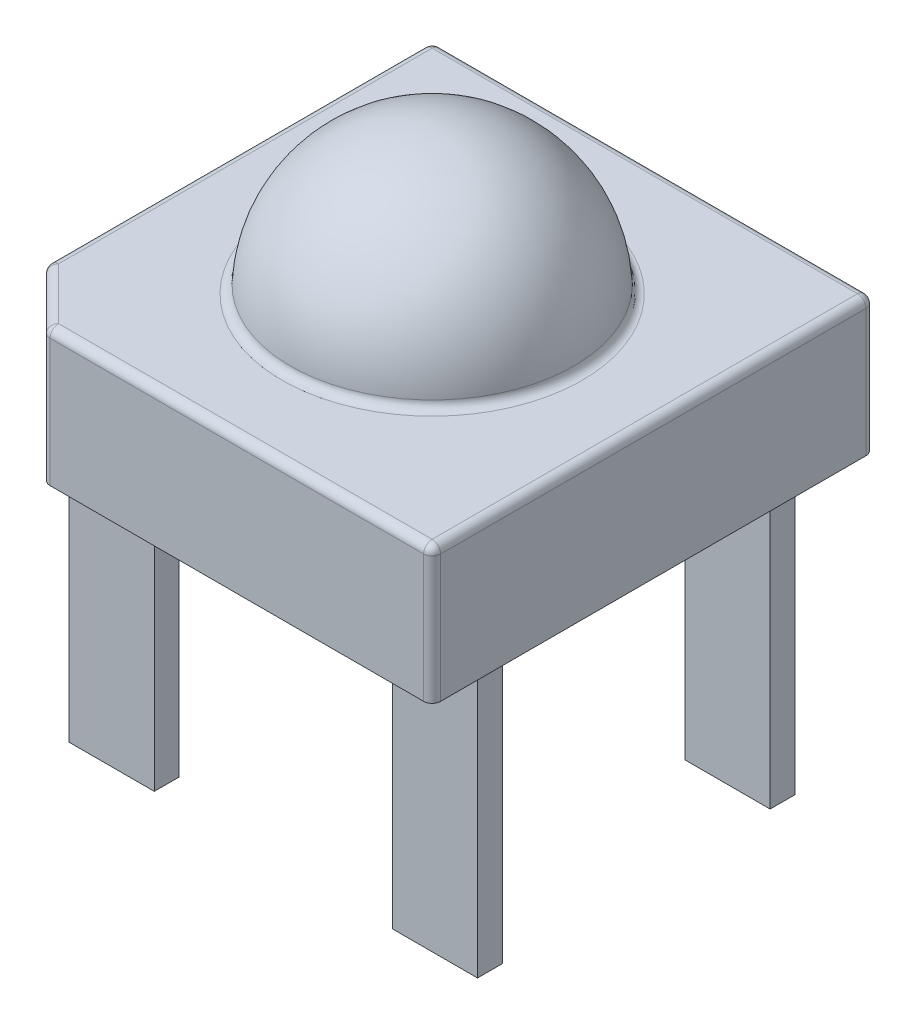
ISO-10303-21;
HEADER;
FILE_DESCRIPTION(('STEP AP214'),'2;1');
FILE_NAME('part.step','',(''),(''),'','','');
FILE_SCHEMA(('AUTOMOTIVE_DESIGN { 1 0 10303 214 1 1 1 1 }'));
ENDSEC;
DATA;
#1=APPLICATION_CONTEXT('core data for automotive mechanical design processes');
#2=APPLICATION_PROTOCOL_DEFINITION('international standard','automotive_design',2000,#1);
#3=PRODUCT_CONTEXT('',#1,'mechanical');
#4=PRODUCT('Part','Part','',(#3));
#5=PRODUCT_RELATED_PRODUCT_CATEGORY('part','',(#4));
#6=PRODUCT_DEFINITION_FORMATION('','',#4);
#7=PRODUCT_DEFINITION_CONTEXT('part definition',#1,'design');
#8=PRODUCT_DEFINITION('design','',#6,#7);
#9=PRODUCT_DEFINITION_SHAPE('','',#8);
#10=(LENGTH_UNIT() NAMED_UNIT(*) SI_UNIT(.MILLI.,.METRE.));
#11=(NAMED_UNIT(*) PLANE_ANGLE_UNIT() SI_UNIT($,.RADIAN.));
#12=(NAMED_UNIT(*) SI_UNIT($,.STERADIAN.) SOLID_ANGLE_UNIT());
#13=UNCERTAINTY_MEASURE_WITH_UNIT(LENGTH_MEASURE(1.E-05),#10,'distance_accuracy_value','');
#14=(GEOMETRIC_REPRESENTATION_CONTEXT(3) GLOBAL_UNCERTAINTY_ASSIGNED_CONTEXT((#13)) GLOBAL_UNIT_ASSIGNED_CONTEXT((#10,
#11,#12)) REPRESENTATION_CONTEXT('',''));
#15=CARTESIAN_POINT('',(0.,0.,0.));
#16=DIRECTION('',(0.,0.,1.));
#17=DIRECTION('',(1.,0.,0.));
#18=AXIS2_PLACEMENT_3D('',#15,#16,#17);
#19=CARTESIAN_POINT('',(3.9,0.,-3.9));
#20=DIRECTION('',(0.,-1.,0.));
#21=DIRECTION('',(0.,0.,-1.));
#22=AXIS2_PLACEMENT_3D('',#19,#20,#21);
#23=PLANE('',#22);
#24=DIRECTION('',(0.,0.,1.));
#25=VECTOR('',#24,1.);
#26=CARTESIAN_POINT('',(3.6,0.,-2.8));
#27=LINE('',#26,#25);
#28=CARTESIAN_POINT('',(3.6,0.,-2.8));
#29=VERTEX_POINT('',#28);
#30=CARTESIAN_POINT('',(3.6,0.,-2.36));
#31=VERTEX_POINT('',#30);
#32=EDGE_CURVE('E251',#29,#31,#27,.T.);
#33=ORIENTED_EDGE('',*,*,#32,.F.);
#34=DIRECTION('',(1.,0.,0.));
#35=VECTOR('',#34,1.);
#36=CARTESIAN_POINT('',(3.6,0.,-2.8));
#37=LINE('',#36,#35);
#38=CARTESIAN_POINT('',(2.1,0.,-2.8));
#39=VERTEX_POINT('',#38);
#40=EDGE_CURVE('E248',#39,#29,#37,.T.);
#41=ORIENTED_EDGE('',*,*,#40,.F.);
#42=DIRECTION('',(0.,0.,-1.));
#43=VECTOR('',#42,1.);
#44=CARTESIAN_POINT('',(2.1,0.,-2.8));
#45=LINE('',#44,#43);
#46=CARTESIAN_POINT('',(2.1,0.,-2.36));
#47=VERTEX_POINT('',#46);
#48=EDGE_CURVE('E260',#47,#39,#45,.T.);
#49=ORIENTED_EDGE('',*,*,#48,.F.);
#50=DIRECTION('',(-1.,0.,0.));
#51=VECTOR('',#50,1.);
#52=CARTESIAN_POINT('',(3.6,0.,-2.36));
#53=LINE('',#52,#51);
#54=EDGE_CURVE('E268',#31,#47,#53,.T.);
#55=ORIENTED_EDGE('',*,*,#54,.F.);
#56=EDGE_LOOP('',(#33,#41,#49,#55));
#57=FACE_BOUND('',#56,.T.);
#58=DIRECTION('',(1.,0.,0.));
#59=VECTOR('',#58,1.);
#60=CARTESIAN_POINT('',(-3.6,0.,2.36));
#61=LINE('',#60,#59);
#62=CARTESIAN_POINT('',(-3.6,0.,2.36));
#63=VERTEX_POINT('',#62);
#64=CARTESIAN_POINT('',(-2.1,0.,2.36));
#65=VERTEX_POINT('',#64);
#66=EDGE_CURVE('E322',#63,#65,#61,.T.);
#67=ORIENTED_EDGE('',*,*,#66,.F.);
#68=DIRECTION('',(0.,0.,-1.));
#69=VECTOR('',#68,1.);
#70=CARTESIAN_POINT('',(-3.6,0.,2.8));
#71=LINE('',#70,#69);
#72=CARTESIAN_POINT('',(-3.6,0.,2.8));
#73=VERTEX_POINT('',#72);
#74=EDGE_CURVE('E308',#73,#63,#71,.T.);
#75=ORIENTED_EDGE('',*,*,#74,.F.);
#76=DIRECTION('',(-1.,0.,0.));
#77=VECTOR('',#76,1.);
#78=CARTESIAN_POINT('',(-3.6,0.,2.8));
#79=LINE('',#78,#77);
#80=CARTESIAN_POINT('',(-2.1,0.,2.8));
#81=VERTEX_POINT('',#80);
#82=EDGE_CURVE('E313',#81,#73,#79,.T.);
#83=ORIENTED_EDGE('',*,*,#82,.F.);
#84=DIRECTION('',(0.,0.,1.));
#85=VECTOR('',#84,1.);
#86=CARTESIAN_POINT('',(-2.1,0.,2.8));
#87=LINE('',#86,#85);
#88=EDGE_CURVE('E324',#65,#81,#87,.T.);
#89=ORIENTED_EDGE('',*,*,#88,.F.);
#90=EDGE_LOOP('',(#67,#75,#83,#89));
#91=FACE_BOUND('',#90,.T.);
#92=DIRECTION('',(0.,0.,1.));
#93=VECTOR('',#92,1.);
#94=CARTESIAN_POINT('',(-3.9,0.,2.9));
#95=LINE('',#94,#93);
#96=CARTESIAN_POINT('',(-3.9,0.,-3.75));
#97=VERTEX_POINT('',#96);
#98=CARTESIAN_POINT('',(-3.9,0.,2.83786796564404));
#99=VERTEX_POINT('',#98);
#100=EDGE_CURVE('E344',#97,#99,#95,.T.);
#101=ORIENTED_EDGE('',*,*,#100,.F.);
#102=CARTESIAN_POINT('',(-3.75,0.,-3.75));
#103=DIRECTION('',(0.,-1.,0.));
#104=DIRECTION('',(0.,0.,-1.));
#105=AXIS2_PLACEMENT_3D('',#102,#103,#104);
#106=CIRCLE('',#105,0.15);
#107=CARTESIAN_POINT('',(-3.75,0.,-3.9));
#108=VERTEX_POINT('',#107);
#109=EDGE_CURVE('E11',#97,#108,#106,.T.);
#110=ORIENTED_EDGE('',*,*,#109,.T.);
#111=DIRECTION('',(-1.,0.,0.));
#112=VECTOR('',#111,1.);
#113=CARTESIAN_POINT('',(-3.9,0.,-3.9));
#114=LINE('',#113,#112);
#115=CARTESIAN_POINT('',(3.75,0.,-3.9));
#116=VERTEX_POINT('',#115);
#117=EDGE_CURVE('E341',#116,#108,#114,.T.);
#118=ORIENTED_EDGE('',*,*,#117,.F.);
#119=CARTESIAN_POINT('',(3.75,0.,-3.75));
#120=DIRECTION('',(0.,-1.,0.));
#121=DIRECTION('',(0.,0.,-1.));
#122=AXIS2_PLACEMENT_3D('',#119,#120,#121);
#123=CIRCLE('',#122,0.15);
#124=CARTESIAN_POINT('',(3.9,0.,-3.75));
#125=VERTEX_POINT('',#124);
#126=EDGE_CURVE('E42',#116,#125,#123,.T.);
#127=ORIENTED_EDGE('',*,*,#126,.T.);
#128=DIRECTION('',(0.,0.,-1.));
#129=VECTOR('',#128,1.);
#130=CARTESIAN_POINT('',(3.9,0.,3.9));
#131=LINE('',#130,#129);
#132=CARTESIAN_POINT('',(3.9,0.,3.75));
#133=VERTEX_POINT('',#132);
#134=EDGE_CURVE('E338',#133,#125,#131,.T.);
#135=ORIENTED_EDGE('',*,*,#134,.F.);
#136=CARTESIAN_POINT('',(3.75,0.,3.75));
#137=DIRECTION('',(0.,-1.,0.));
#138=DIRECTION('',(0.,0.,-1.));
#139=AXIS2_PLACEMENT_3D('',#136,#137,#138);
#140=CIRCLE('',#139,0.15);
#141=CARTESIAN_POINT('',(3.75,0.,3.9));
#142=VERTEX_POINT('',#141);
#143=EDGE_CURVE('E405',#133,#142,#140,.T.);
#144=ORIENTED_EDGE('',*,*,#143,.T.);
#145=DIRECTION('',(1.,0.,0.));
#146=VECTOR('',#145,1.);
#147=CARTESIAN_POINT('',(-2.9,0.,3.9));
#148=LINE('',#147,#146);
#149=CARTESIAN_POINT('',(-2.83786796564403,0.,3.9));
#150=VERTEX_POINT('',#149);
#151=EDGE_CURVE('E350',#150,#142,#148,.T.);
#152=ORIENTED_EDGE('',*,*,#151,.F.);
#153=CARTESIAN_POINT('',(-2.83786796564403,0.,3.75));
#154=DIRECTION('',(0.,-1.,0.));
#155=DIRECTION('',(0.,0.,-1.));
#156=AXIS2_PLACEMENT_3D('',#153,#154,#155);
#157=CIRCLE('',#156,0.15);
#158=CARTESIAN_POINT('',(-2.94393398282202,0.,3.85606601717798));
#159=VERTEX_POINT('',#158);
#160=EDGE_CURVE('E401',#150,#159,#157,.T.);
#161=ORIENTED_EDGE('',*,*,#160,.T.);
#162=DIRECTION('',(0.707106781186548,0.,0.707106781186548));
#163=VECTOR('',#162,1.);
#164=CARTESIAN_POINT('',(-3.9,0.,2.9));
#165=LINE('',#164,#163);
#166=CARTESIAN_POINT('',(-3.85606601717798,0.,2.94393398282202));
#167=VERTEX_POINT('',#166);
#168=EDGE_CURVE('E347',#167,#159,#165,.T.);
#169=ORIENTED_EDGE('',*,*,#168,.F.);
#170=CARTESIAN_POINT('',(-3.75,0.,2.83786796564404));
#171=DIRECTION('',(0.,-1.,0.));
#172=DIRECTION('',(0.,0.,-1.));
#173=AXIS2_PLACEMENT_3D('',#170,#171,#172);
#174=CIRCLE('',#173,0.15);
#175=EDGE_CURVE('E403',#167,#99,#174,.T.);
#176=ORIENTED_EDGE('',*,*,#175,.T.);
#177=EDGE_LOOP('',(#101,#110,#118,#127,#135,#144,#152,#161,#169,#176));
#178=FACE_BOUND('',#177,.T.);
#179=DIRECTION('',(0.,0.,-1.));
#180=VECTOR('',#179,1.);
#181=CARTESIAN_POINT('',(2.1,0.,2.8));
#182=LINE('',#181,#180);
#183=CARTESIAN_POINT('',(2.1,0.,2.8));
#184=VERTEX_POINT('',#183);
#185=CARTESIAN_POINT('',(2.1,0.,2.36));
#186=VERTEX_POINT('',#185);
#187=EDGE_CURVE('E293',#184,#186,#182,.T.);
#188=ORIENTED_EDGE('',*,*,#187,.F.);
#189=DIRECTION('',(-1.,0.,0.));
#190=VECTOR('',#189,1.);
#191=CARTESIAN_POINT('',(3.6,0.,2.8));
#192=LINE('',#191,#190);
#193=CARTESIAN_POINT('',(3.6,0.,2.8));
#194=VERTEX_POINT('',#193);
#195=EDGE_CURVE('E279',#194,#184,#192,.T.);
#196=ORIENTED_EDGE('',*,*,#195,.F.);
#197=DIRECTION('',(0.,0.,1.));
#198=VECTOR('',#197,1.);
#199=CARTESIAN_POINT('',(3.6,0.,2.8));
#200=LINE('',#199,#198);
#201=CARTESIAN_POINT('',(3.6,0.,2.36));
#202=VERTEX_POINT('',#201);
#203=EDGE_CURVE('E284',#202,#194,#200,.T.);
#204=ORIENTED_EDGE('',*,*,#203,.F.);
#205=DIRECTION('',(1.,0.,0.));
#206=VECTOR('',#205,1.);
#207=CARTESIAN_POINT('',(3.6,0.,2.36));
#208=LINE('',#207,#206);
#209=EDGE_CURVE('E295',#186,#202,#208,.T.);
#210=ORIENTED_EDGE('',*,*,#209,.F.);
#211=EDGE_LOOP('',(#188,#196,#204,#210));
#212=FACE_BOUND('',#211,.T.);
#213=DIRECTION('',(0.,0.,1.));
#214=VECTOR('',#213,1.);
#215=CARTESIAN_POINT('',(-2.1,0.,-2.8));
#216=LINE('',#215,#214);
#217=CARTESIAN_POINT('',(-2.1,0.,-2.8));
#218=VERTEX_POINT('',#217);
#219=CARTESIAN_POINT('',(-2.1,0.,-2.36));
#220=VERTEX_POINT('',#219);
#221=EDGE_CURVE('E934',#218,#220,#216,.T.);
#222=ORIENTED_EDGE('',*,*,#221,.F.);
#223=DIRECTION('',(1.,0.,0.));
#224=VECTOR('',#223,1.);
#225=CARTESIAN_POINT('',(-3.6,0.,-2.8));
#226=LINE('',#225,#224);
#227=CARTESIAN_POINT('',(-3.6,0.,-2.8));
#228=VERTEX_POINT('',#227);
#229=EDGE_CURVE('E246',#228,#218,#226,.T.);
#230=ORIENTED_EDGE('',*,*,#229,.F.);
#231=DIRECTION('',(0.,0.,-1.));
#232=VECTOR('',#231,1.);
#233=CARTESIAN_POINT('',(-3.6,0.,-2.8));
#234=LINE('',#233,#232);
#235=CARTESIAN_POINT('',(-3.6,0.,-2.36));
#236=VERTEX_POINT('',#235);
#237=EDGE_CURVE('E242',#236,#228,#234,.T.);
#238=ORIENTED_EDGE('',*,*,#237,.F.);
#239=DIRECTION('',(-1.,0.,0.));
#240=VECTOR('',#239,1.);
#241=CARTESIAN_POINT('',(-3.6,0.,-2.36));
#242=LINE('',#241,#240);
#243=EDGE_CURVE('E931',#220,#236,#242,.T.);
#244=ORIENTED_EDGE('',*,*,#243,.F.);
#245=EDGE_LOOP('',(#222,#230,#238,#244));
#246=FACE_BOUND('',#245,.T.);
#247=ADVANCED_FACE('F33',(#57,#91,#178,#212,#246),#23,.T.);
#248=CARTESIAN_POINT('',(3.9,2.4,-3.9));
#249=DIRECTION('',(0.,-1.,0.));
#250=DIRECTION('',(0.,0.,-1.));
#251=AXIS2_PLACEMENT_3D('',#248,#249,#250);
#252=PLANE('',#251);
#253=CARTESIAN_POINT('',(0.,2.4,0.));
#254=DIRECTION('',(0.,-1.,0.));
#255=DIRECTION('',(0.,0.,-1.));
#256=AXIS2_PLACEMENT_3D('',#253,#254,#255);
#257=CIRCLE('',#256,2.64575131106459);
#258=CARTESIAN_POINT('',(0.,2.4,-2.64575131106459));
#259=VERTEX_POINT('',#258);
#260=EDGE_CURVE('E367',#259,#259,#257,.T.);
#261=ORIENTED_EDGE('',*,*,#260,.T.);
#262=EDGE_LOOP('',(#261));
#263=FACE_BOUND('',#262,.T.);
#264=DIRECTION('',(0.707106781186548,0.,0.707106781186548));
#265=VECTOR('',#264,1.);
#266=CARTESIAN_POINT('',(-3.29393398282202,2.4,3.29393398282202));
#267=LINE('',#266,#265);
#268=CARTESIAN_POINT('',(-3.75,2.4,2.83786796564404));
#269=VERTEX_POINT('',#268);
#270=CARTESIAN_POINT('',(-2.83786796564403,2.4,3.75));
#271=VERTEX_POINT('',#270);
#272=EDGE_CURVE('E362',#269,#271,#267,.T.);
#273=ORIENTED_EDGE('',*,*,#272,.T.);
#274=DIRECTION('',(1.,0.,0.));
#275=VECTOR('',#274,1.);
#276=CARTESIAN_POINT('',(3.9,2.4,3.75));
#277=LINE('',#276,#275);
#278=CARTESIAN_POINT('',(3.75,2.4,3.75));
#279=VERTEX_POINT('',#278);
#280=EDGE_CURVE('E364',#271,#279,#277,.T.);
#281=ORIENTED_EDGE('',*,*,#280,.T.);
#282=DIRECTION('',(0.,0.,-1.));
#283=VECTOR('',#282,1.);
#284=CARTESIAN_POINT('',(3.75,2.4,-3.9));
#285=LINE('',#284,#283);
#286=CARTESIAN_POINT('',(3.75,2.4,-3.75));
#287=VERTEX_POINT('',#286);
#288=EDGE_CURVE('E356',#279,#287,#285,.T.);
#289=ORIENTED_EDGE('',*,*,#288,.T.);
#290=DIRECTION('',(-1.,0.,0.));
#291=VECTOR('',#290,1.);
#292=CARTESIAN_POINT('',(3.9,2.4,-3.75));
#293=LINE('',#292,#291);
#294=CARTESIAN_POINT('',(-3.75,2.4,-3.75));
#295=VERTEX_POINT('',#294);
#296=EDGE_CURVE('E358',#287,#295,#293,.T.);
#297=ORIENTED_EDGE('',*,*,#296,.T.);
#298=DIRECTION('',(0.,0.,1.));
#299=VECTOR('',#298,1.);
#300=CARTESIAN_POINT('',(-3.75,2.4,-3.9));
#301=LINE('',#300,#299);
#302=EDGE_CURVE('E360',#295,#269,#301,.T.);
#303=ORIENTED_EDGE('',*,*,#302,.T.);
#304=EDGE_LOOP('',(#273,#281,#289,#297,#303));
#305=FACE_BOUND('',#304,.T.);
#306=ADVANCED_FACE('F484',(#263,#305),#252,.F.);
#307=CARTESIAN_POINT('',(3.9,2.4,3.9));
#308=DIRECTION('',(-1.,0.,0.));
#309=DIRECTION('',(0.,0.,1.));
#310=AXIS2_PLACEMENT_3D('',#307,#308,#309);
#311=PLANE('',#310);
#312=ORIENTED_EDGE('',*,*,#134,.T.);
#313=DIRECTION('',(0.,-1.,0.));
#314=VECTOR('',#313,1.);
#315=CARTESIAN_POINT('',(3.9,2.4,-3.75));
#316=LINE('',#315,#314);
#317=CARTESIAN_POINT('',(3.9,2.25,-3.75));
#318=VERTEX_POINT('',#317);
#319=EDGE_CURVE('E399',#125,#318,#316,.F.);
#320=ORIENTED_EDGE('',*,*,#319,.T.);
#321=DIRECTION('',(0.,0.,-1.));
#322=VECTOR('',#321,1.);
#323=CARTESIAN_POINT('',(3.9,2.25,3.9));
#324=LINE('',#323,#322);
#325=CARTESIAN_POINT('',(3.9,2.25,3.75));
#326=VERTEX_POINT('',#325);
#327=EDGE_CURVE('E397',#318,#326,#324,.F.);
#328=ORIENTED_EDGE('',*,*,#327,.T.);
#329=DIRECTION('',(0.,-1.,0.));
#330=VECTOR('',#329,1.);
#331=CARTESIAN_POINT('',(3.9,2.4,3.75));
#332=LINE('',#331,#330);
#333=EDGE_CURVE('E395',#326,#133,#332,.T.);
#334=ORIENTED_EDGE('',*,*,#333,.T.);
#335=EDGE_LOOP('',(#312,#320,#328,#334));
#336=FACE_BOUND('',#335,.T.);
#337=ADVANCED_FACE('F503',(#336),#311,.F.);
#338=CARTESIAN_POINT('',(-3.9,2.4,-3.9));
#339=DIRECTION('',(0.,0.,1.));
#340=DIRECTION('',(1.,0.,0.));
#341=AXIS2_PLACEMENT_3D('',#338,#339,#340);
#342=PLANE('',#341);
#343=ORIENTED_EDGE('',*,*,#117,.T.);
#344=DIRECTION('',(0.,-1.,0.));
#345=VECTOR('',#344,1.);
#346=CARTESIAN_POINT('',(-3.75,2.4,-3.9));
#347=LINE('',#346,#345);
#348=CARTESIAN_POINT('',(-3.75,2.25,-3.9));
#349=VERTEX_POINT('',#348);
#350=EDGE_CURVE('E393',#108,#349,#347,.F.);
#351=ORIENTED_EDGE('',*,*,#350,.T.);
#352=DIRECTION('',(-1.,0.,0.));
#353=VECTOR('',#352,1.);
#354=CARTESIAN_POINT('',(-3.9,2.25,-3.9));
#355=LINE('',#354,#353);
#356=CARTESIAN_POINT('',(3.75,2.25,-3.9));
#357=VERTEX_POINT('',#356);
#358=EDGE_CURVE('E391',#349,#357,#355,.F.);
#359=ORIENTED_EDGE('',*,*,#358,.T.);
#360=DIRECTION('',(0.,-1.,0.));
#361=VECTOR('',#360,1.);
#362=CARTESIAN_POINT('',(3.75,2.4,-3.9));
#363=LINE('',#362,#361);
#364=EDGE_CURVE('E389',#357,#116,#363,.T.);
#365=ORIENTED_EDGE('',*,*,#364,.T.);
#366=EDGE_LOOP('',(#343,#351,#359,#365));
#367=FACE_BOUND('',#366,.T.);
#368=ADVANCED_FACE('F493',(#367),#342,.F.);
#369=CARTESIAN_POINT('',(-3.9,2.4,2.9));
#370=DIRECTION('',(1.,0.,0.));
#371=DIRECTION('',(0.,0.,-1.));
#372=AXIS2_PLACEMENT_3D('',#369,#370,#371);
#373=PLANE('',#372);
#374=DIRECTION('',(0.,0.,1.));
#375=VECTOR('',#374,1.);
#376=CARTESIAN_POINT('',(-3.9,2.25,2.9));
#377=LINE('',#376,#375);
#378=CARTESIAN_POINT('',(-3.9,2.25,2.83786796564404));
#379=VERTEX_POINT('',#378);
#380=CARTESIAN_POINT('',(-3.9,2.25,-3.75));
#381=VERTEX_POINT('',#380);
#382=EDGE_CURVE('E385',#379,#381,#377,.F.);
#383=ORIENTED_EDGE('',*,*,#382,.T.);
#384=DIRECTION('',(0.,-1.,0.));
#385=VECTOR('',#384,1.);
#386=CARTESIAN_POINT('',(-3.9,2.4,-3.75));
#387=LINE('',#386,#385);
#388=EDGE_CURVE('E387',#381,#97,#387,.T.);
#389=ORIENTED_EDGE('',*,*,#388,.T.);
#390=ORIENTED_EDGE('',*,*,#100,.T.);
#391=DIRECTION('',(0.,-1.,0.));
#392=VECTOR('',#391,1.);
#393=CARTESIAN_POINT('',(-3.9,2.4,2.83786796564404));
#394=LINE('',#393,#392);
#395=EDGE_CURVE('E383',#99,#379,#394,.F.);
#396=ORIENTED_EDGE('',*,*,#395,.T.);
#397=EDGE_LOOP('',(#383,#389,#390,#396));
#398=FACE_BOUND('',#397,.T.);
#399=ADVANCED_FACE('F461',(#398),#373,.F.);
#400=CARTESIAN_POINT('',(-3.9,2.4,2.9));
#401=DIRECTION('',(0.707106781186548,0.,-0.707106781186548));
#402=DIRECTION('',(-0.707106781186548,0.,-0.707106781186548));
#403=AXIS2_PLACEMENT_3D('',#400,#401,#402);
#404=PLANE('',#403);
#405=DIRECTION('',(0.707106781186548,0.,0.707106781186548));
#406=VECTOR('',#405,1.);
#407=CARTESIAN_POINT('',(-3.9,2.25,2.9));
#408=LINE('',#407,#406);
#409=CARTESIAN_POINT('',(-2.94393398282202,2.25,3.85606601717798));
#410=VERTEX_POINT('',#409);
#411=CARTESIAN_POINT('',(-3.85606601717798,2.25,2.94393398282202));
#412=VERTEX_POINT('',#411);
#413=EDGE_CURVE('E379',#410,#412,#408,.F.);
#414=ORIENTED_EDGE('',*,*,#413,.T.);
#415=DIRECTION('',(0.,-1.,0.));
#416=VECTOR('',#415,1.);
#417=CARTESIAN_POINT('',(-3.85606601717798,2.4,2.94393398282202));
#418=LINE('',#417,#416);
#419=EDGE_CURVE('E381',#412,#167,#418,.T.);
#420=ORIENTED_EDGE('',*,*,#419,.T.);
#421=ORIENTED_EDGE('',*,*,#168,.T.);
#422=DIRECTION('',(0.,-1.,0.));
#423=VECTOR('',#422,1.);
#424=CARTESIAN_POINT('',(-2.94393398282202,2.4,3.85606601717798));
#425=LINE('',#424,#423);
#426=EDGE_CURVE('E377',#159,#410,#425,.F.);
#427=ORIENTED_EDGE('',*,*,#426,.T.);
#428=EDGE_LOOP('',(#414,#420,#421,#427));
#429=FACE_BOUND('',#428,.T.);
#430=ADVANCED_FACE('F529',(#429),#404,.F.);
#431=CARTESIAN_POINT('',(-2.9,2.4,3.9));
#432=DIRECTION('',(0.,0.,-1.));
#433=DIRECTION('',(-1.,0.,0.));
#434=AXIS2_PLACEMENT_3D('',#431,#432,#433);
#435=PLANE('',#434);
#436=ORIENTED_EDGE('',*,*,#151,.T.);
#437=DIRECTION('',(0.,-1.,0.));
#438=VECTOR('',#437,1.);
#439=CARTESIAN_POINT('',(3.75,2.4,3.9));
#440=LINE('',#439,#438);
#441=CARTESIAN_POINT('',(3.75,2.25,3.9));
#442=VERTEX_POINT('',#441);
#443=EDGE_CURVE('E375',#142,#442,#440,.F.);
#444=ORIENTED_EDGE('',*,*,#443,.T.);
#445=DIRECTION('',(1.,0.,0.));
#446=VECTOR('',#445,1.);
#447=CARTESIAN_POINT('',(-2.9,2.25,3.9));
#448=LINE('',#447,#446);
#449=CARTESIAN_POINT('',(-2.83786796564403,2.25,3.9));
#450=VERTEX_POINT('',#449);
#451=EDGE_CURVE('E372',#442,#450,#448,.F.);
#452=ORIENTED_EDGE('',*,*,#451,.T.);
#453=DIRECTION('',(0.,-1.,0.));
#454=VECTOR('',#453,1.);
#455=CARTESIAN_POINT('',(-2.83786796564403,2.4,3.9));
#456=LINE('',#455,#454);
#457=EDGE_CURVE('E370',#450,#150,#456,.T.);
#458=ORIENTED_EDGE('',*,*,#457,.T.);
#459=EDGE_LOOP('',(#436,#444,#452,#458));
#460=FACE_BOUND('',#459,.T.);
#461=ADVANCED_FACE('F520',(#460),#435,.F.);
#462=CARTESIAN_POINT('',(0.,2.4,0.));
#463=DIRECTION('',(0.,-1.,0.));
#464=DIRECTION('',(-1.,0.,0.));
#465=AXIS2_PLACEMENT_3D('',#462,#463,#464);
#466=SPHERICAL_SURFACE('',#465,2.5);
#467=CARTESIAN_POINT('',(0.,2.54150943396226,0.));
#468=DIRECTION('',(0.,-1.,0.));
#469=DIRECTION('',(0.,0.,-1.));
#470=AXIS2_PLACEMENT_3D('',#467,#468,#469);
#471=CIRCLE('',#470,2.49599180289112);
#472=CARTESIAN_POINT('',(0.,2.54150943396226,-2.49599180289112));
#473=VERTEX_POINT('',#472);
#474=EDGE_CURVE('E353',#473,#473,#471,.F.);
#475=ORIENTED_EDGE('',*,*,#474,.T.);
#476=EDGE_LOOP('',(#475));
#477=FACE_BOUND('',#476,.T.);
#478=ADVANCED_FACE('F536',(#477),#466,.T.);
#479=CARTESIAN_POINT('',(0.,2.55,0.));
#480=DIRECTION('',(0.,-1.,0.));
#481=DIRECTION('',(0.,0.,-1.));
#482=AXIS2_PLACEMENT_3D('',#479,#480,#481);
#483=TOROIDAL_SURFACE('',#482,2.64575131106459,0.15);
#484=ORIENTED_EDGE('',*,*,#260,.F.);
#485=EDGE_LOOP('',(#484));
#486=FACE_BOUND('',#485,.T.);
#487=ORIENTED_EDGE('',*,*,#474,.F.);
#488=EDGE_LOOP('',(#487));
#489=FACE_BOUND('',#488,.T.);
#490=ADVANCED_FACE('F552',(#486,#489),#483,.F.);
#491=CARTESIAN_POINT('',(-3.75,2.4,-3.75));
#492=DIRECTION('',(0.,-1.,0.));
#493=DIRECTION('',(0.,0.,-1.));
#494=AXIS2_PLACEMENT_3D('',#491,#492,#493);
#495=CYLINDRICAL_SURFACE('',#494,0.15);
#496=CARTESIAN_POINT('',(-3.75,2.25,-3.75));
#497=DIRECTION('',(0.,1.,0.));
#498=DIRECTION('',(0.,0.,1.));
#499=AXIS2_PLACEMENT_3D('',#496,#497,#498);
#500=CIRCLE('',#499,0.15);
#501=EDGE_CURVE('E37',#349,#381,#500,.T.);
#502=ORIENTED_EDGE('',*,*,#501,.F.);
#503=ORIENTED_EDGE('',*,*,#350,.F.);
#504=ORIENTED_EDGE('',*,*,#109,.F.);
#505=ORIENTED_EDGE('',*,*,#388,.F.);
#506=EDGE_LOOP('',(#502,#503,#504,#505));
#507=FACE_BOUND('',#506,.T.);
#508=ADVANCED_FACE('F35',(#507),#495,.T.);
#509=CARTESIAN_POINT('',(-3.75,2.25,-3.75));
#510=DIRECTION('',(0.,0.,1.));
#511=DIRECTION('',(1.,0.,0.));
#512=AXIS2_PLACEMENT_3D('',#509,#510,#511);
#513=SPHERICAL_SURFACE('',#512,0.15);
#514=CARTESIAN_POINT('',(-3.75,2.25,-3.75));
#515=DIRECTION('',(-1.,0.,0.));
#516=DIRECTION('',(0.,0.,1.));
#517=AXIS2_PLACEMENT_3D('',#514,#515,#516);
#518=CIRCLE('',#517,0.15);
#519=EDGE_CURVE('E441',#349,#295,#518,.F.);
#520=ORIENTED_EDGE('',*,*,#519,.F.);
#521=ORIENTED_EDGE('',*,*,#501,.T.);
#522=CARTESIAN_POINT('',(-3.75,2.25,-3.75));
#523=DIRECTION('',(0.,0.,-1.));
#524=DIRECTION('',(-1.,0.,0.));
#525=AXIS2_PLACEMENT_3D('',#522,#523,#524);
#526=CIRCLE('',#525,0.15);
#527=EDGE_CURVE('E443',#295,#381,#526,.F.);
#528=ORIENTED_EDGE('',*,*,#527,.F.);
#529=EDGE_LOOP('',(#520,#521,#528));
#530=FACE_BOUND('',#529,.T.);
#531=ADVANCED_FACE('F453',(#530),#513,.T.);
#532=CARTESIAN_POINT('',(-3.75,2.4,2.83786796564404));
#533=DIRECTION('',(0.,-1.,0.));
#534=DIRECTION('',(0.,0.,-1.));
#535=AXIS2_PLACEMENT_3D('',#532,#533,#534);
#536=CYLINDRICAL_SURFACE('',#535,0.15);
#537=ORIENTED_EDGE('',*,*,#175,.F.);
#538=ORIENTED_EDGE('',*,*,#419,.F.);
#539=CARTESIAN_POINT('',(-3.75,2.25,2.83786796564404));
#540=DIRECTION('',(0.,1.,0.));
#541=DIRECTION('',(0.,0.,1.));
#542=AXIS2_PLACEMENT_3D('',#539,#540,#541);
#543=CIRCLE('',#542,0.15);
#544=EDGE_CURVE('E438',#379,#412,#543,.T.);
#545=ORIENTED_EDGE('',*,*,#544,.F.);
#546=ORIENTED_EDGE('',*,*,#395,.F.);
#547=EDGE_LOOP('',(#537,#538,#545,#546));
#548=FACE_BOUND('',#547,.T.);
#549=ADVANCED_FACE('F470',(#548),#536,.T.);
#550=CARTESIAN_POINT('',(-3.75,2.25,-3.9));
#551=DIRECTION('',(0.,0.,1.));
#552=DIRECTION('',(1.,0.,0.));
#553=AXIS2_PLACEMENT_3D('',#550,#551,#552);
#554=CYLINDRICAL_SURFACE('',#553,0.15);
#555=ORIENTED_EDGE('',*,*,#527,.T.);
#556=ORIENTED_EDGE('',*,*,#382,.F.);
#557=CARTESIAN_POINT('',(-3.75,2.25,2.83786796564404));
#558=DIRECTION('',(0.,0.,1.));
#559=DIRECTION('',(1.,0.,0.));
#560=AXIS2_PLACEMENT_3D('',#557,#558,#559);
#561=CIRCLE('',#560,0.15);
#562=EDGE_CURVE('E435',#269,#379,#561,.T.);
#563=ORIENTED_EDGE('',*,*,#562,.F.);
#564=ORIENTED_EDGE('',*,*,#302,.F.);
#565=EDGE_LOOP('',(#555,#556,#563,#564));
#566=FACE_BOUND('',#565,.T.);
#567=ADVANCED_FACE('F473',(#566),#554,.T.);
#568=CARTESIAN_POINT('',(3.9,2.25,-3.75));
#569=DIRECTION('',(-1.,0.,0.));
#570=DIRECTION('',(0.,0.,1.));
#571=AXIS2_PLACEMENT_3D('',#568,#569,#570);
#572=CYLINDRICAL_SURFACE('',#571,0.15);
#573=ORIENTED_EDGE('',*,*,#519,.T.);
#574=ORIENTED_EDGE('',*,*,#296,.F.);
#575=CARTESIAN_POINT('',(3.75,2.25,-3.75));
#576=DIRECTION('',(1.,0.,0.));
#577=DIRECTION('',(0.,0.,-1.));
#578=AXIS2_PLACEMENT_3D('',#575,#576,#577);
#579=CIRCLE('',#578,0.15);
#580=EDGE_CURVE('E432',#357,#287,#579,.T.);
#581=ORIENTED_EDGE('',*,*,#580,.F.);
#582=ORIENTED_EDGE('',*,*,#358,.F.);
#583=EDGE_LOOP('',(#573,#574,#581,#582));
#584=FACE_BOUND('',#583,.T.);
#585=ADVANCED_FACE('F490',(#584),#572,.T.);
#586=CARTESIAN_POINT('',(3.75,2.4,-3.75));
#587=DIRECTION('',(0.,-1.,0.));
#588=DIRECTION('',(0.,0.,-1.));
#589=AXIS2_PLACEMENT_3D('',#586,#587,#588);
#590=CYLINDRICAL_SURFACE('',#589,0.15);
#591=ORIENTED_EDGE('',*,*,#126,.F.);
#592=ORIENTED_EDGE('',*,*,#364,.F.);
#593=CARTESIAN_POINT('',(3.75,2.25,-3.75));
#594=DIRECTION('',(0.,1.,0.));
#595=DIRECTION('',(0.,0.,1.));
#596=AXIS2_PLACEMENT_3D('',#593,#594,#595);
#597=CIRCLE('',#596,0.15);
#598=EDGE_CURVE('E429',#318,#357,#597,.T.);
#599=ORIENTED_EDGE('',*,*,#598,.F.);
#600=ORIENTED_EDGE('',*,*,#319,.F.);
#601=EDGE_LOOP('',(#591,#592,#599,#600));
#602=FACE_BOUND('',#601,.T.);
#603=ADVANCED_FACE('F497',(#602),#590,.T.);
#604=CARTESIAN_POINT('',(-3.75,2.25,2.83786796564404));
#605=DIRECTION('',(0.,0.,1.));
#606=DIRECTION('',(1.,0.,0.));
#607=AXIS2_PLACEMENT_3D('',#604,#605,#606);
#608=SPHERICAL_SURFACE('',#607,0.15);
#609=ORIENTED_EDGE('',*,*,#562,.T.);
#610=ORIENTED_EDGE('',*,*,#544,.T.);
#611=CARTESIAN_POINT('',(-3.75,2.25,2.83786796564404));
#612=DIRECTION('',(-0.707106781186548,0.,-0.707106781186548));
#613=DIRECTION('',(-0.707106781186548,0.,0.707106781186548));
#614=AXIS2_PLACEMENT_3D('',#611,#612,#613);
#615=CIRCLE('',#614,0.15);
#616=EDGE_CURVE('E426',#269,#412,#615,.F.);
#617=ORIENTED_EDGE('',*,*,#616,.F.);
#618=EDGE_LOOP('',(#609,#610,#617));
#619=FACE_BOUND('',#618,.T.);
#620=ADVANCED_FACE('F477',(#619),#608,.T.);
#621=CARTESIAN_POINT('',(3.75,2.25,-3.75));
#622=DIRECTION('',(0.,0.,1.));
#623=DIRECTION('',(1.,0.,0.));
#624=AXIS2_PLACEMENT_3D('',#621,#622,#623);
#625=SPHERICAL_SURFACE('',#624,0.15);
#626=ORIENTED_EDGE('',*,*,#598,.T.);
#627=ORIENTED_EDGE('',*,*,#580,.T.);
#628=CARTESIAN_POINT('',(3.75,2.25,-3.75));
#629=DIRECTION('',(0.,0.,-1.));
#630=DIRECTION('',(-1.,0.,0.));
#631=AXIS2_PLACEMENT_3D('',#628,#629,#630);
#632=CIRCLE('',#631,0.15);
#633=EDGE_CURVE('E423',#318,#287,#632,.F.);
#634=ORIENTED_EDGE('',*,*,#633,.F.);
#635=EDGE_LOOP('',(#626,#627,#634));
#636=FACE_BOUND('',#635,.T.);
#637=ADVANCED_FACE('F747',(#636),#625,.T.);
#638=CARTESIAN_POINT('',(-2.83786796564403,2.4,3.75));
#639=DIRECTION('',(0.,-1.,0.));
#640=DIRECTION('',(0.,0.,-1.));
#641=AXIS2_PLACEMENT_3D('',#638,#639,#640);
#642=CYLINDRICAL_SURFACE('',#641,0.15);
#643=ORIENTED_EDGE('',*,*,#160,.F.);
#644=ORIENTED_EDGE('',*,*,#457,.F.);
#645=CARTESIAN_POINT('',(-2.83786796564403,2.25,3.75));
#646=DIRECTION('',(0.,1.,0.));
#647=DIRECTION('',(0.,0.,1.));
#648=AXIS2_PLACEMENT_3D('',#645,#646,#647);
#649=CIRCLE('',#648,0.15);
#650=EDGE_CURVE('E420',#410,#450,#649,.T.);
#651=ORIENTED_EDGE('',*,*,#650,.F.);
#652=ORIENTED_EDGE('',*,*,#426,.F.);
#653=EDGE_LOOP('',(#643,#644,#651,#652));
#654=FACE_BOUND('',#653,.T.);
#655=ADVANCED_FACE('F526',(#654),#642,.T.);
#656=CARTESIAN_POINT('',(-3.29393398282202,2.25,3.29393398282202));
#657=DIRECTION('',(0.707106781186548,0.,0.707106781186548));
#658=DIRECTION('',(0.707106781186548,0.,-0.707106781186548));
#659=AXIS2_PLACEMENT_3D('',#656,#657,#658);
#660=CYLINDRICAL_SURFACE('',#659,0.15);
#661=ORIENTED_EDGE('',*,*,#616,.T.);
#662=ORIENTED_EDGE('',*,*,#413,.F.);
#663=CARTESIAN_POINT('',(-2.83786796564403,2.25,3.75));
#664=DIRECTION('',(0.707106781186545,0.,0.70710678118655));
#665=DIRECTION('',(0.70710678118655,0.,-0.707106781186545));
#666=AXIS2_PLACEMENT_3D('',#663,#664,#665);
#667=CIRCLE('',#666,0.15);
#668=EDGE_CURVE('E417',#271,#410,#667,.T.);
#669=ORIENTED_EDGE('',*,*,#668,.F.);
#670=ORIENTED_EDGE('',*,*,#272,.F.);
#671=EDGE_LOOP('',(#661,#662,#669,#670));
#672=FACE_BOUND('',#671,.T.);
#673=ADVANCED_FACE('F481',(#672),#660,.T.);
#674=CARTESIAN_POINT('',(3.75,2.25,-3.9));
#675=DIRECTION('',(0.,0.,-1.));
#676=DIRECTION('',(-1.,0.,0.));
#677=AXIS2_PLACEMENT_3D('',#674,#675,#676);
#678=CYLINDRICAL_SURFACE('',#677,0.15);
#679=ORIENTED_EDGE('',*,*,#633,.T.);
#680=ORIENTED_EDGE('',*,*,#288,.F.);
#681=CARTESIAN_POINT('',(3.75,2.25,3.75));
#682=DIRECTION('',(0.,0.,1.));
#683=DIRECTION('',(1.,0.,0.));
#684=AXIS2_PLACEMENT_3D('',#681,#682,#683);
#685=CIRCLE('',#684,0.15);
#686=EDGE_CURVE('E414',#326,#279,#685,.T.);
#687=ORIENTED_EDGE('',*,*,#686,.F.);
#688=ORIENTED_EDGE('',*,*,#327,.F.);
#689=EDGE_LOOP('',(#679,#680,#687,#688));
#690=FACE_BOUND('',#689,.T.);
#691=ADVANCED_FACE('F513',(#690),#678,.T.);
#692=CARTESIAN_POINT('',(3.75,2.4,3.75));
#693=DIRECTION('',(0.,-1.,0.));
#694=DIRECTION('',(0.,0.,-1.));
#695=AXIS2_PLACEMENT_3D('',#692,#693,#694);
#696=CYLINDRICAL_SURFACE('',#695,0.15);
#697=ORIENTED_EDGE('',*,*,#143,.F.);
#698=ORIENTED_EDGE('',*,*,#333,.F.);
#699=CARTESIAN_POINT('',(3.75,2.25,3.75));
#700=DIRECTION('',(0.,1.,0.));
#701=DIRECTION('',(0.,0.,1.));
#702=AXIS2_PLACEMENT_3D('',#699,#700,#701);
#703=CIRCLE('',#702,0.15);
#704=EDGE_CURVE('E411',#442,#326,#703,.T.);
#705=ORIENTED_EDGE('',*,*,#704,.F.);
#706=ORIENTED_EDGE('',*,*,#443,.F.);
#707=EDGE_LOOP('',(#697,#698,#705,#706));
#708=FACE_BOUND('',#707,.T.);
#709=ADVANCED_FACE('F509',(#708),#696,.T.);
#710=CARTESIAN_POINT('',(-2.83786796564403,2.25,3.75));
#711=DIRECTION('',(0.,0.,1.));
#712=DIRECTION('',(1.,0.,0.));
#713=AXIS2_PLACEMENT_3D('',#710,#711,#712);
#714=SPHERICAL_SURFACE('',#713,0.15);
#715=ORIENTED_EDGE('',*,*,#668,.T.);
#716=ORIENTED_EDGE('',*,*,#650,.T.);
#717=CARTESIAN_POINT('',(-2.83786796564403,2.25,3.75));
#718=DIRECTION('',(-1.,0.,0.));
#719=DIRECTION('',(0.,-1.,0.));
#720=AXIS2_PLACEMENT_3D('',#717,#718,#719);
#721=CIRCLE('',#720,0.15);
#722=EDGE_CURVE('E409',#271,#450,#721,.F.);
#723=ORIENTED_EDGE('',*,*,#722,.F.);
#724=EDGE_LOOP('',(#715,#716,#723));
#725=FACE_BOUND('',#724,.T.);
#726=ADVANCED_FACE('F715',(#725),#714,.T.);
#727=CARTESIAN_POINT('',(3.75,2.25,3.75));
#728=DIRECTION('',(0.,0.,1.));
#729=DIRECTION('',(1.,0.,0.));
#730=AXIS2_PLACEMENT_3D('',#727,#728,#729);
#731=SPHERICAL_SURFACE('',#730,0.15);
#732=ORIENTED_EDGE('',*,*,#704,.T.);
#733=ORIENTED_EDGE('',*,*,#686,.T.);
#734=CARTESIAN_POINT('',(3.75,2.25,3.75));
#735=DIRECTION('',(1.,0.,0.));
#736=DIRECTION('',(0.,0.,-1.));
#737=AXIS2_PLACEMENT_3D('',#734,#735,#736);
#738=CIRCLE('',#737,0.15);
#739=EDGE_CURVE('E337',#442,#279,#738,.F.);
#740=ORIENTED_EDGE('',*,*,#739,.F.);
#741=EDGE_LOOP('',(#732,#733,#740));
#742=FACE_BOUND('',#741,.T.);
#743=ADVANCED_FACE('F516',(#742),#731,.T.);
#744=CARTESIAN_POINT('',(3.9,2.25,3.75));
#745=DIRECTION('',(1.,0.,0.));
#746=DIRECTION('',(0.,0.,-1.));
#747=AXIS2_PLACEMENT_3D('',#744,#745,#746);
#748=CYLINDRICAL_SURFACE('',#747,0.15);
#749=ORIENTED_EDGE('',*,*,#722,.T.);
#750=ORIENTED_EDGE('',*,*,#451,.F.);
#751=ORIENTED_EDGE('',*,*,#739,.T.);
#752=ORIENTED_EDGE('',*,*,#280,.F.);
#753=EDGE_LOOP('',(#749,#750,#751,#752));
#754=FACE_BOUND('',#753,.T.);
#755=ADVANCED_FACE('F518',(#754),#748,.T.);
#756=CARTESIAN_POINT('',(-3.6,-4.85,2.8));
#757=DIRECTION('',(1.,0.,0.));
#758=DIRECTION('',(0.,0.,-1.));
#759=AXIS2_PLACEMENT_3D('',#756,#757,#758);
#760=PLANE('',#759);
#761=ORIENTED_EDGE('',*,*,#74,.T.);
#762=DIRECTION('',(0.,1.,0.));
#763=VECTOR('',#762,1.);
#764=CARTESIAN_POINT('',(-3.6,-4.85,2.36));
#765=LINE('',#764,#763);
#766=CARTESIAN_POINT('',(-3.6,-4.85,2.36));
#767=VERTEX_POINT('',#766);
#768=EDGE_CURVE('E335',#767,#63,#765,.T.);
#769=ORIENTED_EDGE('',*,*,#768,.F.);
#770=DIRECTION('',(0.,0.,-1.));
#771=VECTOR('',#770,1.);
#772=CARTESIAN_POINT('',(-3.6,-4.85,2.8));
#773=LINE('',#772,#771);
#774=CARTESIAN_POINT('',(-3.6,-4.85,2.8));
#775=VERTEX_POINT('',#774);
#776=EDGE_CURVE('E309',#775,#767,#773,.T.);
#777=ORIENTED_EDGE('',*,*,#776,.F.);
#778=DIRECTION('',(0.,1.,0.));
#779=VECTOR('',#778,1.);
#780=CARTESIAN_POINT('',(-3.6,-4.85,2.8));
#781=LINE('',#780,#779);
#782=EDGE_CURVE('E319',#775,#73,#781,.T.);
#783=ORIENTED_EDGE('',*,*,#782,.T.);
#784=EDGE_LOOP('',(#761,#769,#777,#783));
#785=FACE_BOUND('',#784,.T.);
#786=ADVANCED_FACE('F554',(#785),#760,.F.);
#787=CARTESIAN_POINT('',(-3.6,-4.85,2.36));
#788=DIRECTION('',(0.,0.,1.));
#789=DIRECTION('',(1.,0.,0.));
#790=AXIS2_PLACEMENT_3D('',#787,#788,#789);
#791=PLANE('',#790);
#792=ORIENTED_EDGE('',*,*,#66,.T.);
#793=DIRECTION('',(0.,1.,0.));
#794=VECTOR('',#793,1.);
#795=CARTESIAN_POINT('',(-2.1,-4.85,2.36));
#796=LINE('',#795,#794);
#797=CARTESIAN_POINT('',(-2.1,-4.85,2.36));
#798=VERTEX_POINT('',#797);
#799=EDGE_CURVE('E332',#798,#65,#796,.T.);
#800=ORIENTED_EDGE('',*,*,#799,.F.);
#801=DIRECTION('',(1.,0.,0.));
#802=VECTOR('',#801,1.);
#803=CARTESIAN_POINT('',(-3.6,-4.85,2.36));
#804=LINE('',#803,#802);
#805=EDGE_CURVE('E312',#767,#798,#804,.T.);
#806=ORIENTED_EDGE('',*,*,#805,.F.);
#807=ORIENTED_EDGE('',*,*,#768,.T.);
#808=EDGE_LOOP('',(#792,#800,#806,#807));
#809=FACE_BOUND('',#808,.T.);
#810=ADVANCED_FACE('F557',(#809),#791,.F.);
#811=CARTESIAN_POINT('',(-2.1,-4.85,2.8));
#812=DIRECTION('',(-1.,0.,0.));
#813=DIRECTION('',(0.,0.,1.));
#814=AXIS2_PLACEMENT_3D('',#811,#812,#813);
#815=PLANE('',#814);
#816=ORIENTED_EDGE('',*,*,#88,.T.);
#817=DIRECTION('',(0.,1.,0.));
#818=VECTOR('',#817,1.);
#819=CARTESIAN_POINT('',(-2.1,-4.85,2.8));
#820=LINE('',#819,#818);
#821=CARTESIAN_POINT('',(-2.1,-4.85,2.8));
#822=VERTEX_POINT('',#821);
#823=EDGE_CURVE('E330',#822,#81,#820,.T.);
#824=ORIENTED_EDGE('',*,*,#823,.F.);
#825=DIRECTION('',(0.,0.,1.));
#826=VECTOR('',#825,1.);
#827=CARTESIAN_POINT('',(-2.1,-4.85,2.8));
#828=LINE('',#827,#826);
#829=EDGE_CURVE('E315',#798,#822,#828,.T.);
#830=ORIENTED_EDGE('',*,*,#829,.F.);
#831=ORIENTED_EDGE('',*,*,#799,.T.);
#832=EDGE_LOOP('',(#816,#824,#830,#831));
#833=FACE_BOUND('',#832,.T.);
#834=ADVANCED_FACE('F561',(#833),#815,.F.);
#835=CARTESIAN_POINT('',(-3.6,-4.85,2.8));
#836=DIRECTION('',(0.,0.,-1.));
#837=DIRECTION('',(-1.,0.,0.));
#838=AXIS2_PLACEMENT_3D('',#835,#836,#837);
#839=PLANE('',#838);
#840=ORIENTED_EDGE('',*,*,#82,.T.);
#841=ORIENTED_EDGE('',*,*,#782,.F.);
#842=DIRECTION('',(-1.,0.,0.));
#843=VECTOR('',#842,1.);
#844=CARTESIAN_POINT('',(-3.6,-4.85,2.8));
#845=LINE('',#844,#843);
#846=EDGE_CURVE('E317',#822,#775,#845,.T.);
#847=ORIENTED_EDGE('',*,*,#846,.F.);
#848=ORIENTED_EDGE('',*,*,#823,.T.);
#849=EDGE_LOOP('',(#840,#841,#847,#848));
#850=FACE_BOUND('',#849,.T.);
#851=ADVANCED_FACE('F565',(#850),#839,.F.);
#852=CARTESIAN_POINT('',(-3.6,-4.85,2.36));
#853=DIRECTION('',(0.,-1.,0.));
#854=DIRECTION('',(0.,0.,-1.));
#855=AXIS2_PLACEMENT_3D('',#852,#853,#854);
#856=PLANE('',#855);
#857=ORIENTED_EDGE('',*,*,#776,.T.);
#858=ORIENTED_EDGE('',*,*,#805,.T.);
#859=ORIENTED_EDGE('',*,*,#829,.T.);
#860=ORIENTED_EDGE('',*,*,#846,.T.);
#861=EDGE_LOOP('',(#857,#858,#859,#860));
#862=FACE_BOUND('',#861,.T.);
#863=ADVANCED_FACE('F569',(#862),#856,.T.);
#864=CARTESIAN_POINT('',(3.6,-4.85,2.8));
#865=DIRECTION('',(0.,0.,-1.));
#866=DIRECTION('',(-1.,0.,0.));
#867=AXIS2_PLACEMENT_3D('',#864,#865,#866);
#868=PLANE('',#867);
#869=ORIENTED_EDGE('',*,*,#195,.T.);
#870=DIRECTION('',(0.,1.,0.));
#871=VECTOR('',#870,1.);
#872=CARTESIAN_POINT('',(2.1,-4.85,2.8));
#873=LINE('',#872,#871);
#874=CARTESIAN_POINT('',(2.1,-4.85,2.8));
#875=VERTEX_POINT('',#874);
#876=EDGE_CURVE('E306',#875,#184,#873,.T.);
#877=ORIENTED_EDGE('',*,*,#876,.F.);
#878=DIRECTION('',(-1.,0.,0.));
#879=VECTOR('',#878,1.);
#880=CARTESIAN_POINT('',(3.6,-4.85,2.8));
#881=LINE('',#880,#879);
#882=CARTESIAN_POINT('',(3.6,-4.85,2.8));
#883=VERTEX_POINT('',#882);
#884=EDGE_CURVE('E280',#883,#875,#881,.T.);
#885=ORIENTED_EDGE('',*,*,#884,.F.);
#886=DIRECTION('',(0.,1.,0.));
#887=VECTOR('',#886,1.);
#888=CARTESIAN_POINT('',(3.6,-4.85,2.8));
#889=LINE('',#888,#887);
#890=EDGE_CURVE('E290',#883,#194,#889,.T.);
#891=ORIENTED_EDGE('',*,*,#890,.T.);
#892=EDGE_LOOP('',(#869,#877,#885,#891));
#893=FACE_BOUND('',#892,.T.);
#894=ADVANCED_FACE('F573',(#893),#868,.F.);
#895=CARTESIAN_POINT('',(2.1,-4.85,2.8));
#896=DIRECTION('',(1.,0.,0.));
#897=DIRECTION('',(0.,0.,-1.));
#898=AXIS2_PLACEMENT_3D('',#895,#896,#897);
#899=PLANE('',#898);
#900=ORIENTED_EDGE('',*,*,#187,.T.);
#901=DIRECTION('',(0.,1.,0.));
#902=VECTOR('',#901,1.);
#903=CARTESIAN_POINT('',(2.1,-4.85,2.36));
#904=LINE('',#903,#902);
#905=CARTESIAN_POINT('',(2.1,-4.85,2.36));
#906=VERTEX_POINT('',#905);
#907=EDGE_CURVE('E303',#906,#186,#904,.T.);
#908=ORIENTED_EDGE('',*,*,#907,.F.);
#909=DIRECTION('',(0.,0.,-1.));
#910=VECTOR('',#909,1.);
#911=CARTESIAN_POINT('',(2.1,-4.85,2.8));
#912=LINE('',#911,#910);
#913=EDGE_CURVE('E283',#875,#906,#912,.T.);
#914=ORIENTED_EDGE('',*,*,#913,.F.);
#915=ORIENTED_EDGE('',*,*,#876,.T.);
#916=EDGE_LOOP('',(#900,#908,#914,#915));
#917=FACE_BOUND('',#916,.T.);
#918=ADVANCED_FACE('F577',(#917),#899,.F.);
#919=CARTESIAN_POINT('',(3.6,-4.85,2.36));
#920=DIRECTION('',(0.,0.,1.));
#921=DIRECTION('',(1.,0.,0.));
#922=AXIS2_PLACEMENT_3D('',#919,#920,#921);
#923=PLANE('',#922);
#924=ORIENTED_EDGE('',*,*,#209,.T.);
#925=DIRECTION('',(0.,1.,0.));
#926=VECTOR('',#925,1.);
#927=CARTESIAN_POINT('',(3.6,-4.85,2.36));
#928=LINE('',#927,#926);
#929=CARTESIAN_POINT('',(3.6,-4.85,2.36));
#930=VERTEX_POINT('',#929);
#931=EDGE_CURVE('E301',#930,#202,#928,.T.);
#932=ORIENTED_EDGE('',*,*,#931,.F.);
#933=DIRECTION('',(1.,0.,0.));
#934=VECTOR('',#933,1.);
#935=CARTESIAN_POINT('',(3.6,-4.85,2.36));
#936=LINE('',#935,#934);
#937=EDGE_CURVE('E286',#906,#930,#936,.T.);
#938=ORIENTED_EDGE('',*,*,#937,.F.);
#939=ORIENTED_EDGE('',*,*,#907,.T.);
#940=EDGE_LOOP('',(#924,#932,#938,#939));
#941=FACE_BOUND('',#940,.T.);
#942=ADVANCED_FACE('F581',(#941),#923,.F.);
#943=CARTESIAN_POINT('',(3.6,-4.85,2.8));
#944=DIRECTION('',(-1.,0.,0.));
#945=DIRECTION('',(0.,0.,1.));
#946=AXIS2_PLACEMENT_3D('',#943,#944,#945);
#947=PLANE('',#946);
#948=ORIENTED_EDGE('',*,*,#203,.T.);
#949=ORIENTED_EDGE('',*,*,#890,.F.);
#950=DIRECTION('',(0.,0.,1.));
#951=VECTOR('',#950,1.);
#952=CARTESIAN_POINT('',(3.6,-4.85,2.8));
#953=LINE('',#952,#951);
#954=EDGE_CURVE('E288',#930,#883,#953,.T.);
#955=ORIENTED_EDGE('',*,*,#954,.F.);
#956=ORIENTED_EDGE('',*,*,#931,.T.);
#957=EDGE_LOOP('',(#948,#949,#955,#956));
#958=FACE_BOUND('',#957,.T.);
#959=ADVANCED_FACE('F585',(#958),#947,.F.);
#960=CARTESIAN_POINT('',(2.1,-4.85,2.8));
#961=DIRECTION('',(0.,-1.,0.));
#962=DIRECTION('',(0.,0.,-1.));
#963=AXIS2_PLACEMENT_3D('',#960,#961,#962);
#964=PLANE('',#963);
#965=ORIENTED_EDGE('',*,*,#884,.T.);
#966=ORIENTED_EDGE('',*,*,#913,.T.);
#967=ORIENTED_EDGE('',*,*,#937,.T.);
#968=ORIENTED_EDGE('',*,*,#954,.T.);
#969=EDGE_LOOP('',(#965,#966,#967,#968));
#970=FACE_BOUND('',#969,.T.);
#971=ADVANCED_FACE('F589',(#970),#964,.T.);
#972=CARTESIAN_POINT('',(3.6,-4.85,-2.8));
#973=DIRECTION('',(0.,0.,1.));
#974=DIRECTION('',(1.,0.,0.));
#975=AXIS2_PLACEMENT_3D('',#972,#973,#974);
#976=PLANE('',#975);
#977=ORIENTED_EDGE('',*,*,#40,.T.);
#978=DIRECTION('',(0.,1.,0.));
#979=VECTOR('',#978,1.);
#980=CARTESIAN_POINT('',(3.6,-4.85,-2.8));
#981=LINE('',#980,#979);
#982=CARTESIAN_POINT('',(3.6,-4.85,-2.8));
#983=VERTEX_POINT('',#982);
#984=EDGE_CURVE('E277',#983,#29,#981,.T.);
#985=ORIENTED_EDGE('',*,*,#984,.F.);
#986=DIRECTION('',(1.,0.,0.));
#987=VECTOR('',#986,1.);
#988=CARTESIAN_POINT('',(3.6,-4.85,-2.8));
#989=LINE('',#988,#987);
#990=CARTESIAN_POINT('',(2.1,-4.85,-2.8));
#991=VERTEX_POINT('',#990);
#992=EDGE_CURVE('E256',#991,#983,#989,.T.);
#993=ORIENTED_EDGE('',*,*,#992,.F.);
#994=DIRECTION('',(0.,1.,0.));
#995=VECTOR('',#994,1.);
#996=CARTESIAN_POINT('',(2.1,-4.85,-2.8));
#997=LINE('',#996,#995);
#998=EDGE_CURVE('E265',#991,#39,#997,.T.);
#999=ORIENTED_EDGE('',*,*,#998,.T.);
#1000=EDGE_LOOP('',(#977,#985,#993,#999));
#1001=FACE_BOUND('',#1000,.T.);
#1002=ADVANCED_FACE('F593',(#1001),#976,.F.);
#1003=CARTESIAN_POINT('',(3.6,-4.85,-2.8));
#1004=DIRECTION('',(-1.,0.,0.));
#1005=DIRECTION('',(0.,0.,1.));
#1006=AXIS2_PLACEMENT_3D('',#1003,#1004,#1005);
#1007=PLANE('',#1006);
#1008=ORIENTED_EDGE('',*,*,#32,.T.);
#1009=DIRECTION('',(0.,1.,0.));
#1010=VECTOR('',#1009,1.);
#1011=CARTESIAN_POINT('',(3.6,-4.85,-2.36));
#1012=LINE('',#1011,#1010);
#1013=CARTESIAN_POINT('',(3.6,-4.85,-2.36));
#1014=VERTEX_POINT('',#1013);
#1015=EDGE_CURVE('E274',#1014,#31,#1012,.T.);
#1016=ORIENTED_EDGE('',*,*,#1015,.F.);
#1017=DIRECTION('',(0.,0.,1.));
#1018=VECTOR('',#1017,1.);
#1019=CARTESIAN_POINT('',(3.6,-4.85,-2.8));
#1020=LINE('',#1019,#1018);
#1021=EDGE_CURVE('E259',#983,#1014,#1020,.T.);
#1022=ORIENTED_EDGE('',*,*,#1021,.F.);
#1023=ORIENTED_EDGE('',*,*,#984,.T.);
#1024=EDGE_LOOP('',(#1008,#1016,#1022,#1023));
#1025=FACE_BOUND('',#1024,.T.);
#1026=ADVANCED_FACE('F597',(#1025),#1007,.F.);
#1027=CARTESIAN_POINT('',(3.6,-4.85,-2.36));
#1028=DIRECTION('',(0.,0.,-1.));
#1029=DIRECTION('',(-1.,0.,0.));
#1030=AXIS2_PLACEMENT_3D('',#1027,#1028,#1029);
#1031=PLANE('',#1030);
#1032=ORIENTED_EDGE('',*,*,#54,.T.);
#1033=DIRECTION('',(0.,1.,0.));
#1034=VECTOR('',#1033,1.);
#1035=CARTESIAN_POINT('',(2.1,-4.85,-2.36));
#1036=LINE('',#1035,#1034);
#1037=CARTESIAN_POINT('',(2.1,-4.85,-2.36));
#1038=VERTEX_POINT('',#1037);
#1039=EDGE_CURVE('E58',#1038,#47,#1036,.T.);
#1040=ORIENTED_EDGE('',*,*,#1039,.F.);
#1041=DIRECTION('',(-1.,0.,0.));
#1042=VECTOR('',#1041,1.);
#1043=CARTESIAN_POINT('',(3.6,-4.85,-2.36));
#1044=LINE('',#1043,#1042);
#1045=EDGE_CURVE('E262',#1014,#1038,#1044,.T.);
#1046=ORIENTED_EDGE('',*,*,#1045,.F.);
#1047=ORIENTED_EDGE('',*,*,#1015,.T.);
#1048=EDGE_LOOP('',(#1032,#1040,#1046,#1047));
#1049=FACE_BOUND('',#1048,.T.);
#1050=ADVANCED_FACE('F601',(#1049),#1031,.F.);
#1051=CARTESIAN_POINT('',(2.1,-4.85,-2.8));
#1052=DIRECTION('',(1.,0.,0.));
#1053=DIRECTION('',(0.,0.,-1.));
#1054=AXIS2_PLACEMENT_3D('',#1051,#1052,#1053);
#1055=PLANE('',#1054);
#1056=ORIENTED_EDGE('',*,*,#48,.T.);
#1057=ORIENTED_EDGE('',*,*,#998,.F.);
#1058=DIRECTION('',(0.,0.,-1.));
#1059=VECTOR('',#1058,1.);
#1060=CARTESIAN_POINT('',(2.1,-4.85,-2.8));
#1061=LINE('',#1060,#1059);
#1062=EDGE_CURVE('E264',#1038,#991,#1061,.T.);
#1063=ORIENTED_EDGE('',*,*,#1062,.F.);
#1064=ORIENTED_EDGE('',*,*,#1039,.T.);
#1065=EDGE_LOOP('',(#1056,#1057,#1063,#1064));
#1066=FACE_BOUND('',#1065,.T.);
#1067=ADVANCED_FACE('F605',(#1066),#1055,.F.);
#1068=CARTESIAN_POINT('',(2.1,-4.85,-2.8));
#1069=DIRECTION('',(0.,1.,0.));
#1070=DIRECTION('',(0.,0.,1.));
#1071=AXIS2_PLACEMENT_3D('',#1068,#1069,#1070);
#1072=PLANE('',#1071);
#1073=ORIENTED_EDGE('',*,*,#992,.T.);
#1074=ORIENTED_EDGE('',*,*,#1021,.T.);
#1075=ORIENTED_EDGE('',*,*,#1045,.T.);
#1076=ORIENTED_EDGE('',*,*,#1062,.T.);
#1077=EDGE_LOOP('',(#1073,#1074,#1075,#1076));
#1078=FACE_BOUND('',#1077,.T.);
#1079=ADVANCED_FACE('F609',(#1078),#1072,.F.);
#1080=CARTESIAN_POINT('',(-3.6,-4.85,-2.8));
#1081=DIRECTION('',(0.,0.,1.));
#1082=DIRECTION('',(1.,0.,0.));
#1083=AXIS2_PLACEMENT_3D('',#1080,#1081,#1082);
#1084=PLANE('',#1083);
#1085=ORIENTED_EDGE('',*,*,#229,.T.);
#1086=DIRECTION('',(0.,1.,0.));
#1087=VECTOR('',#1086,1.);
#1088=CARTESIAN_POINT('',(-2.1,-4.85,-2.8));
#1089=LINE('',#1088,#1087);
#1090=CARTESIAN_POINT('',(-2.1,-4.85,-2.8));
#1091=VERTEX_POINT('',#1090);
#1092=EDGE_CURVE('E227',#1091,#218,#1089,.T.);
#1093=ORIENTED_EDGE('',*,*,#1092,.F.);
#1094=DIRECTION('',(1.,0.,0.));
#1095=VECTOR('',#1094,1.);
#1096=CARTESIAN_POINT('',(-3.6,-4.85,-2.8));
#1097=LINE('',#1096,#1095);
#1098=CARTESIAN_POINT('',(-3.6,-4.85,-2.8));
#1099=VERTEX_POINT('',#1098);
#1100=EDGE_CURVE('E234',#1099,#1091,#1097,.T.);
#1101=ORIENTED_EDGE('',*,*,#1100,.F.);
#1102=DIRECTION('',(0.,1.,0.));
#1103=VECTOR('',#1102,1.);
#1104=CARTESIAN_POINT('',(-3.6,-4.85,-2.8));
#1105=LINE('',#1104,#1103);
#1106=EDGE_CURVE('E928',#1099,#228,#1105,.T.);
#1107=ORIENTED_EDGE('',*,*,#1106,.T.);
#1108=EDGE_LOOP('',(#1085,#1093,#1101,#1107));
#1109=FACE_BOUND('',#1108,.T.);
#1110=ADVANCED_FACE('F244',(#1109),#1084,.F.);
#1111=CARTESIAN_POINT('',(-2.1,-4.85,-2.8));
#1112=DIRECTION('',(-1.,0.,0.));
#1113=DIRECTION('',(0.,0.,1.));
#1114=AXIS2_PLACEMENT_3D('',#1111,#1112,#1113);
#1115=PLANE('',#1114);
#1116=ORIENTED_EDGE('',*,*,#221,.T.);
#1117=DIRECTION('',(0.,1.,0.));
#1118=VECTOR('',#1117,1.);
#1119=CARTESIAN_POINT('',(-2.1,-4.85,-2.36));
#1120=LINE('',#1119,#1118);
#1121=CARTESIAN_POINT('',(-2.1,-4.85,-2.36));
#1122=VERTEX_POINT('',#1121);
#1123=EDGE_CURVE('E230',#1122,#220,#1120,.T.);
#1124=ORIENTED_EDGE('',*,*,#1123,.F.);
#1125=DIRECTION('',(0.,0.,1.));
#1126=VECTOR('',#1125,1.);
#1127=CARTESIAN_POINT('',(-2.1,-4.85,-2.8));
#1128=LINE('',#1127,#1126);
#1129=EDGE_CURVE('E223',#1091,#1122,#1128,.T.);
#1130=ORIENTED_EDGE('',*,*,#1129,.F.);
#1131=ORIENTED_EDGE('',*,*,#1092,.T.);
#1132=EDGE_LOOP('',(#1116,#1124,#1130,#1131));
#1133=FACE_BOUND('',#1132,.T.);
#1134=ADVANCED_FACE('F225',(#1133),#1115,.F.);
#1135=CARTESIAN_POINT('',(-3.6,-4.85,-2.36));
#1136=DIRECTION('',(0.,0.,-1.));
#1137=DIRECTION('',(-1.,0.,0.));
#1138=AXIS2_PLACEMENT_3D('',#1135,#1136,#1137);
#1139=PLANE('',#1138);
#1140=ORIENTED_EDGE('',*,*,#243,.T.);
#1141=DIRECTION('',(0.,1.,0.));
#1142=VECTOR('',#1141,1.);
#1143=CARTESIAN_POINT('',(-3.6,-4.85,-2.36));
#1144=LINE('',#1143,#1142);
#1145=CARTESIAN_POINT('',(-3.6,-4.85,-2.36));
#1146=VERTEX_POINT('',#1145);
#1147=EDGE_CURVE('E50',#1146,#236,#1144,.T.);
#1148=ORIENTED_EDGE('',*,*,#1147,.F.);
#1149=DIRECTION('',(-1.,0.,0.));
#1150=VECTOR('',#1149,1.);
#1151=CARTESIAN_POINT('',(-3.6,-4.85,-2.36));
#1152=LINE('',#1151,#1150);
#1153=EDGE_CURVE('E233',#1122,#1146,#1152,.T.);
#1154=ORIENTED_EDGE('',*,*,#1153,.F.);
#1155=ORIENTED_EDGE('',*,*,#1123,.T.);
#1156=EDGE_LOOP('',(#1140,#1148,#1154,#1155));
#1157=FACE_BOUND('',#1156,.T.);
#1158=ADVANCED_FACE('F617',(#1157),#1139,.F.);
#1159=CARTESIAN_POINT('',(-3.6,-4.85,-2.8));
#1160=DIRECTION('',(1.,0.,0.));
#1161=DIRECTION('',(0.,0.,-1.));
#1162=AXIS2_PLACEMENT_3D('',#1159,#1160,#1161);
#1163=PLANE('',#1162);
#1164=ORIENTED_EDGE('',*,*,#237,.T.);
#1165=ORIENTED_EDGE('',*,*,#1106,.F.);
#1166=DIRECTION('',(0.,0.,-1.));
#1167=VECTOR('',#1166,1.);
#1168=CARTESIAN_POINT('',(-3.6,-4.85,-2.8));
#1169=LINE('',#1168,#1167);
#1170=EDGE_CURVE('E238',#1146,#1099,#1169,.T.);
#1171=ORIENTED_EDGE('',*,*,#1170,.F.);
#1172=ORIENTED_EDGE('',*,*,#1147,.T.);
#1173=EDGE_LOOP('',(#1164,#1165,#1171,#1172));
#1174=FACE_BOUND('',#1173,.T.);
#1175=ADVANCED_FACE('F620',(#1174),#1163,.F.);
#1176=CARTESIAN_POINT('',(-2.1,-4.85,-2.8));
#1177=DIRECTION('',(0.,-1.,0.));
#1178=DIRECTION('',(0.,0.,-1.));
#1179=AXIS2_PLACEMENT_3D('',#1176,#1177,#1178);
#1180=PLANE('',#1179);
#1181=ORIENTED_EDGE('',*,*,#1100,.T.);
#1182=ORIENTED_EDGE('',*,*,#1129,.T.);
#1183=ORIENTED_EDGE('',*,*,#1153,.T.);
#1184=ORIENTED_EDGE('',*,*,#1170,.T.);
#1185=EDGE_LOOP('',(#1181,#1182,#1183,#1184));
#1186=FACE_BOUND('',#1185,.T.);
#1187=ADVANCED_FACE('F237',(#1186),#1180,.T.);
#1188=CLOSED_SHELL('',(#247,#306,#337,#368,#399,#430,#461,#478,#490,#508,#531,#549,#567,#585,
#603,#620,#637,#655,#673,#691,#709,#726,#743,#755,#786,#810,#834,#851,#863,#894,#918,#942,#959,
#971,#1002,#1026,#1050,#1067,#1079,#1110,#1134,#1158,#1175,#1187));
#1189=MANIFOLD_SOLID_BREP('B2',#1188);
#1190=ADVANCED_BREP_SHAPE_REPRESENTATION('',(#18,#1189),#14);
#1191=SHAPE_DEFINITION_REPRESENTATION(#9,#1190);
ENDSEC;
END-ISO-10303-21;
